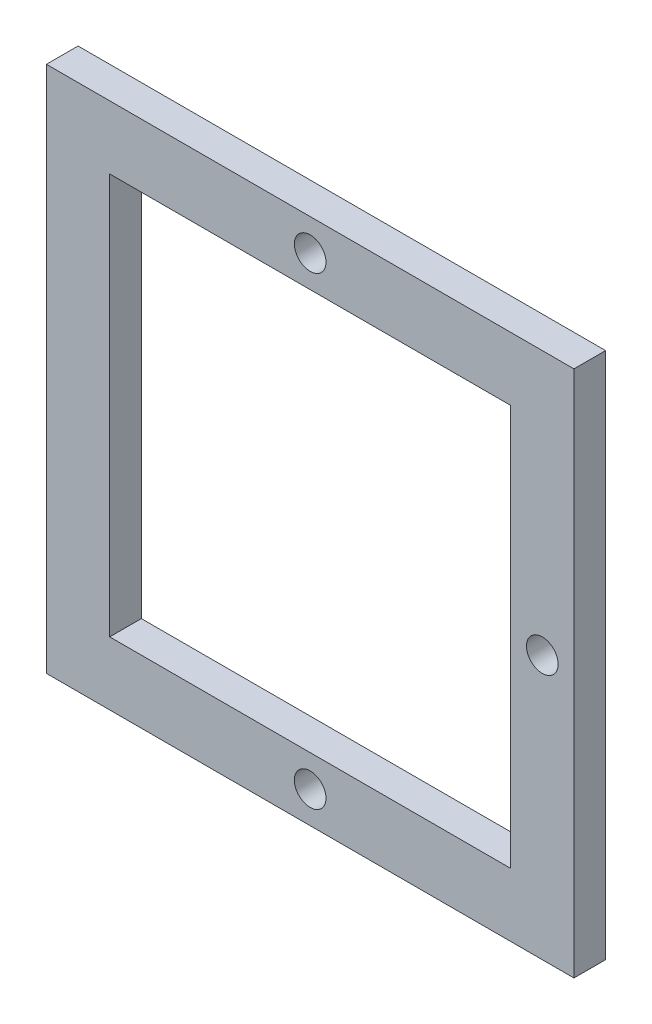
ISO-10303-21;
HEADER;
FILE_DESCRIPTION(('STEP AP214'),'2;1');
FILE_NAME('part.step','',(''),(''),'','','');
FILE_SCHEMA(('AUTOMOTIVE_DESIGN { 1 0 10303 214 1 1 1 1 }'));
ENDSEC;
DATA;
#1=APPLICATION_CONTEXT('core data for automotive mechanical design processes');
#2=APPLICATION_PROTOCOL_DEFINITION('international standard','automotive_design',2000,#1);
#3=PRODUCT_CONTEXT('',#1,'mechanical');
#4=PRODUCT('Part','Part','',(#3));
#5=PRODUCT_RELATED_PRODUCT_CATEGORY('part','',(#4));
#6=PRODUCT_DEFINITION_FORMATION('','',#4);
#7=PRODUCT_DEFINITION_CONTEXT('part definition',#1,'design');
#8=PRODUCT_DEFINITION('design','',#6,#7);
#9=PRODUCT_DEFINITION_SHAPE('','',#8);
#10=(LENGTH_UNIT() NAMED_UNIT(*) SI_UNIT(.MILLI.,.METRE.));
#11=(NAMED_UNIT(*) PLANE_ANGLE_UNIT() SI_UNIT($,.RADIAN.));
#12=(NAMED_UNIT(*) SI_UNIT($,.STERADIAN.) SOLID_ANGLE_UNIT());
#13=UNCERTAINTY_MEASURE_WITH_UNIT(LENGTH_MEASURE(1.E-05),#10,'distance_accuracy_value','');
#14=(GEOMETRIC_REPRESENTATION_CONTEXT(3) GLOBAL_UNCERTAINTY_ASSIGNED_CONTEXT((#13)) GLOBAL_UNIT_ASSIGNED_CONTEXT((#10,
#11,#12)) REPRESENTATION_CONTEXT('',''));
#15=CARTESIAN_POINT('',(0.,0.,0.));
#16=DIRECTION('',(0.,0.,1.));
#17=DIRECTION('',(1.,0.,0.));
#18=AXIS2_PLACEMENT_3D('',#15,#16,#17);
#19=CARTESIAN_POINT('',(-25.,25.,-79.6));
#20=DIRECTION('',(-1.,0.,0.));
#21=DIRECTION('',(0.,1.,0.));
#22=AXIS2_PLACEMENT_3D('',#19,#20,#21);
#23=PLANE('',#22);
#24=DIRECTION('',(0.,-1.,0.));
#25=VECTOR('',#24,1.);
#26=CARTESIAN_POINT('',(-25.,-25.,-76.6));
#27=LINE('',#26,#25);
#28=CARTESIAN_POINT('',(-25.,25.,-76.6));
#29=VERTEX_POINT('',#28);
#30=CARTESIAN_POINT('',(-25.,-25.,-76.6));
#31=VERTEX_POINT('',#30);
#32=EDGE_CURVE('E144',#29,#31,#27,.T.);
#33=ORIENTED_EDGE('',*,*,#32,.T.);
#34=DIRECTION('',(0.,0.,-1.));
#35=VECTOR('',#34,1.);
#36=CARTESIAN_POINT('',(-25.,-25.,-73.6));
#37=LINE('',#36,#35);
#38=CARTESIAN_POINT('',(-25.,-25.,-73.6));
#39=VERTEX_POINT('',#38);
#40=EDGE_CURVE('E185',#39,#31,#37,.T.);
#41=ORIENTED_EDGE('',*,*,#40,.F.);
#42=DIRECTION('',(0.,-1.,0.));
#43=VECTOR('',#42,1.);
#44=CARTESIAN_POINT('',(-25.,-25.,-73.6));
#45=LINE('',#44,#43);
#46=CARTESIAN_POINT('',(-25.,25.,-73.6));
#47=VERTEX_POINT('',#46);
#48=EDGE_CURVE('E149',#47,#39,#45,.T.);
#49=ORIENTED_EDGE('',*,*,#48,.F.);
#50=DIRECTION('',(0.,0.,-1.));
#51=VECTOR('',#50,1.);
#52=CARTESIAN_POINT('',(-25.,25.,-73.6));
#53=LINE('',#52,#51);
#54=EDGE_CURVE('E163',#47,#29,#53,.T.);
#55=ORIENTED_EDGE('',*,*,#54,.T.);
#56=EDGE_LOOP('',(#33,#41,#49,#55));
#57=FACE_BOUND('',#56,.T.);
#58=ADVANCED_FACE('F47',(#57),#23,.T.);
#59=CARTESIAN_POINT('',(-25.,-25.,-79.6));
#60=DIRECTION('',(0.,-1.,0.));
#61=DIRECTION('',(0.,0.,1.));
#62=AXIS2_PLACEMENT_3D('',#59,#60,#61);
#63=PLANE('',#62);
#64=DIRECTION('',(1.,0.,0.));
#65=VECTOR('',#64,1.);
#66=CARTESIAN_POINT('',(25.,-25.,-76.6));
#67=LINE('',#66,#65);
#68=CARTESIAN_POINT('',(25.,-25.,-76.6));
#69=VERTEX_POINT('',#68);
#70=EDGE_CURVE('E166',#31,#69,#67,.T.);
#71=ORIENTED_EDGE('',*,*,#70,.T.);
#72=DIRECTION('',(0.,0.,-1.));
#73=VECTOR('',#72,1.);
#74=CARTESIAN_POINT('',(25.,-25.,-73.6));
#75=LINE('',#74,#73);
#76=CARTESIAN_POINT('',(25.,-25.,-73.6));
#77=VERTEX_POINT('',#76);
#78=EDGE_CURVE('E181',#77,#69,#75,.T.);
#79=ORIENTED_EDGE('',*,*,#78,.F.);
#80=DIRECTION('',(1.,0.,0.));
#81=VECTOR('',#80,1.);
#82=CARTESIAN_POINT('',(25.,-25.,-73.6));
#83=LINE('',#82,#81);
#84=EDGE_CURVE('E153',#39,#77,#83,.T.);
#85=ORIENTED_EDGE('',*,*,#84,.F.);
#86=ORIENTED_EDGE('',*,*,#40,.T.);
#87=EDGE_LOOP('',(#71,#79,#85,#86));
#88=FACE_BOUND('',#87,.T.);
#89=ADVANCED_FACE('F238',(#88),#63,.T.);
#90=CARTESIAN_POINT('',(25.,-25.,-79.6));
#91=DIRECTION('',(1.,0.,0.));
#92=DIRECTION('',(0.,0.,-1.));
#93=AXIS2_PLACEMENT_3D('',#90,#91,#92);
#94=PLANE('',#93);
#95=DIRECTION('',(0.,1.,0.));
#96=VECTOR('',#95,1.);
#97=CARTESIAN_POINT('',(25.,-25.,-76.6));
#98=LINE('',#97,#96);
#99=CARTESIAN_POINT('',(25.,25.,-76.6));
#100=VERTEX_POINT('',#99);
#101=EDGE_CURVE('E169',#69,#100,#98,.T.);
#102=ORIENTED_EDGE('',*,*,#101,.T.);
#103=DIRECTION('',(0.,0.,-1.));
#104=VECTOR('',#103,1.);
#105=CARTESIAN_POINT('',(25.,25.,-73.6));
#106=LINE('',#105,#104);
#107=CARTESIAN_POINT('',(25.,25.,-73.6));
#108=VERTEX_POINT('',#107);
#109=EDGE_CURVE('E177',#108,#100,#106,.T.);
#110=ORIENTED_EDGE('',*,*,#109,.F.);
#111=DIRECTION('',(0.,1.,0.));
#112=VECTOR('',#111,1.);
#113=CARTESIAN_POINT('',(25.,-25.,-73.6));
#114=LINE('',#113,#112);
#115=EDGE_CURVE('E157',#77,#108,#114,.T.);
#116=ORIENTED_EDGE('',*,*,#115,.F.);
#117=ORIENTED_EDGE('',*,*,#78,.T.);
#118=EDGE_LOOP('',(#102,#110,#116,#117));
#119=FACE_BOUND('',#118,.T.);
#120=ADVANCED_FACE('F244',(#119),#94,.T.);
#121=CARTESIAN_POINT('',(25.,25.,-79.6));
#122=DIRECTION('',(0.,1.,0.));
#123=DIRECTION('',(0.,0.,1.));
#124=AXIS2_PLACEMENT_3D('',#121,#122,#123);
#125=PLANE('',#124);
#126=DIRECTION('',(-1.,0.,0.));
#127=VECTOR('',#126,1.);
#128=CARTESIAN_POINT('',(25.,25.,-76.6));
#129=LINE('',#128,#127);
#130=EDGE_CURVE('E154',#100,#29,#129,.T.);
#131=ORIENTED_EDGE('',*,*,#130,.T.);
#132=ORIENTED_EDGE('',*,*,#54,.F.);
#133=DIRECTION('',(-1.,0.,0.));
#134=VECTOR('',#133,1.);
#135=CARTESIAN_POINT('',(25.,25.,-73.6));
#136=LINE('',#135,#134);
#137=EDGE_CURVE('E160',#108,#47,#136,.T.);
#138=ORIENTED_EDGE('',*,*,#137,.F.);
#139=ORIENTED_EDGE('',*,*,#109,.T.);
#140=EDGE_LOOP('',(#131,#132,#138,#139));
#141=FACE_BOUND('',#140,.T.);
#142=ADVANCED_FACE('F248',(#141),#125,.T.);
#143=CARTESIAN_POINT('',(0.,-22.,-76.6));
#144=DIRECTION('',(0.,0.,-1.));
#145=DIRECTION('',(0.,-1.,0.));
#146=AXIS2_PLACEMENT_3D('',#143,#144,#145);
#147=CYLINDRICAL_SURFACE('',#146,1.5);
#148=CARTESIAN_POINT('',(0.,-22.,-73.6));
#149=DIRECTION('',(0.,0.,1.));
#150=DIRECTION('',(1.,0.,0.));
#151=AXIS2_PLACEMENT_3D('',#148,#149,#150);
#152=CIRCLE('',#151,1.5);
#153=CARTESIAN_POINT('',(1.5,-22.,-73.6));
#154=VERTEX_POINT('',#153);
#155=EDGE_CURVE('E197',#154,#154,#152,.T.);
#156=ORIENTED_EDGE('',*,*,#155,.T.);
#157=EDGE_LOOP('',(#156));
#158=FACE_BOUND('',#157,.T.);
#159=CARTESIAN_POINT('',(0.,-22.,-76.6));
#160=DIRECTION('',(0.,0.,-1.));
#161=DIRECTION('',(-1.,0.,0.));
#162=AXIS2_PLACEMENT_3D('',#159,#160,#161);
#163=CIRCLE('',#162,1.5);
#164=CARTESIAN_POINT('',(-1.5,-22.,-76.6));
#165=VERTEX_POINT('',#164);
#166=EDGE_CURVE('E201',#165,#165,#163,.F.);
#167=ORIENTED_EDGE('',*,*,#166,.F.);
#168=EDGE_LOOP('',(#167));
#169=FACE_BOUND('',#168,.T.);
#170=ADVANCED_FACE('F236',(#158,#169),#147,.F.);
#171=CARTESIAN_POINT('',(22.0000003278255,0.,-76.6));
#172=DIRECTION('',(0.,0.,-1.));
#173=DIRECTION('',(0.,-1.,0.));
#174=AXIS2_PLACEMENT_3D('',#171,#172,#173);
#175=CYLINDRICAL_SURFACE('',#174,1.5);
#176=CARTESIAN_POINT('',(22.0000003278255,0.,-73.6));
#177=DIRECTION('',(0.,0.,1.));
#178=DIRECTION('',(1.,0.,0.));
#179=AXIS2_PLACEMENT_3D('',#176,#177,#178);
#180=CIRCLE('',#179,1.5);
#181=CARTESIAN_POINT('',(23.5000003278255,0.,-73.6));
#182=VERTEX_POINT('',#181);
#183=EDGE_CURVE('E200',#182,#182,#180,.T.);
#184=ORIENTED_EDGE('',*,*,#183,.T.);
#185=EDGE_LOOP('',(#184));
#186=FACE_BOUND('',#185,.T.);
#187=CARTESIAN_POINT('',(22.0000003278255,0.,-76.6));
#188=DIRECTION('',(0.,0.,-1.));
#189=DIRECTION('',(-1.,0.,0.));
#190=AXIS2_PLACEMENT_3D('',#187,#188,#189);
#191=CIRCLE('',#190,1.5);
#192=CARTESIAN_POINT('',(20.5000003278255,0.,-76.6));
#193=VERTEX_POINT('',#192);
#194=EDGE_CURVE('E215',#193,#193,#191,.F.);
#195=ORIENTED_EDGE('',*,*,#194,.F.);
#196=EDGE_LOOP('',(#195));
#197=FACE_BOUND('',#196,.T.);
#198=ADVANCED_FACE('F228',(#186,#197),#175,.F.);
#199=CARTESIAN_POINT('',(0.,22.,-76.6));
#200=DIRECTION('',(0.,0.,-1.));
#201=DIRECTION('',(0.,-1.,0.));
#202=AXIS2_PLACEMENT_3D('',#199,#200,#201);
#203=CYLINDRICAL_SURFACE('',#202,1.5);
#204=CARTESIAN_POINT('',(0.,22.,-73.6));
#205=DIRECTION('',(0.,0.,1.));
#206=DIRECTION('',(1.,0.,0.));
#207=AXIS2_PLACEMENT_3D('',#204,#205,#206);
#208=CIRCLE('',#207,1.5);
#209=CARTESIAN_POINT('',(1.5,22.,-73.6));
#210=VERTEX_POINT('',#209);
#211=EDGE_CURVE('E51',#210,#210,#208,.T.);
#212=ORIENTED_EDGE('',*,*,#211,.T.);
#213=EDGE_LOOP('',(#212));
#214=FACE_BOUND('',#213,.T.);
#215=CARTESIAN_POINT('',(0.,22.,-76.6));
#216=DIRECTION('',(0.,0.,-1.));
#217=DIRECTION('',(-1.,0.,0.));
#218=AXIS2_PLACEMENT_3D('',#215,#216,#217);
#219=CIRCLE('',#218,1.5);
#220=CARTESIAN_POINT('',(-1.5,22.,-76.6));
#221=VERTEX_POINT('',#220);
#222=EDGE_CURVE('E219',#221,#221,#219,.F.);
#223=ORIENTED_EDGE('',*,*,#222,.F.);
#224=EDGE_LOOP('',(#223));
#225=FACE_BOUND('',#224,.T.);
#226=ADVANCED_FACE('F49',(#214,#225),#203,.F.);
#227=CARTESIAN_POINT('',(19.,19.,-88.6));
#228=DIRECTION('',(0.,1.,0.));
#229=DIRECTION('',(-1.,0.,0.));
#230=AXIS2_PLACEMENT_3D('',#227,#228,#229);
#231=PLANE('',#230);
#232=DIRECTION('',(0.,0.,1.));
#233=VECTOR('',#232,1.);
#234=CARTESIAN_POINT('',(-19.,19.,-88.6));
#235=LINE('',#234,#233);
#236=CARTESIAN_POINT('',(-19.,19.,-76.6));
#237=VERTEX_POINT('',#236);
#238=CARTESIAN_POINT('',(-19.,19.,-73.6));
#239=VERTEX_POINT('',#238);
#240=EDGE_CURVE('E141',#237,#239,#235,.T.);
#241=ORIENTED_EDGE('',*,*,#240,.F.);
#242=DIRECTION('',(-1.,0.,0.));
#243=VECTOR('',#242,1.);
#244=CARTESIAN_POINT('',(0.,19.,-76.6));
#245=LINE('',#244,#243);
#246=CARTESIAN_POINT('',(19.,19.,-76.6));
#247=VERTEX_POINT('',#246);
#248=EDGE_CURVE('E11',#247,#237,#245,.T.);
#249=ORIENTED_EDGE('',*,*,#248,.F.);
#250=DIRECTION('',(0.,0.,1.));
#251=VECTOR('',#250,1.);
#252=CARTESIAN_POINT('',(19.,19.,-88.6));
#253=LINE('',#252,#251);
#254=CARTESIAN_POINT('',(19.,19.,-73.6));
#255=VERTEX_POINT('',#254);
#256=EDGE_CURVE('E122',#247,#255,#253,.T.);
#257=ORIENTED_EDGE('',*,*,#256,.T.);
#258=DIRECTION('',(-1.,0.,0.));
#259=VECTOR('',#258,1.);
#260=CARTESIAN_POINT('',(19.,19.,-73.6));
#261=LINE('',#260,#259);
#262=EDGE_CURVE('E134',#255,#239,#261,.T.);
#263=ORIENTED_EDGE('',*,*,#262,.T.);
#264=EDGE_LOOP('',(#241,#249,#257,#263));
#265=FACE_BOUND('',#264,.T.);
#266=ADVANCED_FACE('F227',(#265),#231,.F.);
#267=CARTESIAN_POINT('',(-19.,-19.,-88.6));
#268=DIRECTION('',(-1.,0.,0.));
#269=DIRECTION('',(0.,0.,1.));
#270=AXIS2_PLACEMENT_3D('',#267,#268,#269);
#271=PLANE('',#270);
#272=DIRECTION('',(0.,-1.,0.));
#273=VECTOR('',#272,1.);
#274=CARTESIAN_POINT('',(-19.,0.,-76.6));
#275=LINE('',#274,#273);
#276=CARTESIAN_POINT('',(-19.,-19.,-76.6));
#277=VERTEX_POINT('',#276);
#278=EDGE_CURVE('E57',#237,#277,#275,.T.);
#279=ORIENTED_EDGE('',*,*,#278,.F.);
#280=ORIENTED_EDGE('',*,*,#240,.T.);
#281=DIRECTION('',(0.,-1.,0.));
#282=VECTOR('',#281,1.);
#283=CARTESIAN_POINT('',(-19.,-19.,-73.6));
#284=LINE('',#283,#282);
#285=CARTESIAN_POINT('',(-19.,-19.,-73.6));
#286=VERTEX_POINT('',#285);
#287=EDGE_CURVE('E65',#239,#286,#284,.T.);
#288=ORIENTED_EDGE('',*,*,#287,.T.);
#289=DIRECTION('',(0.,0.,1.));
#290=VECTOR('',#289,1.);
#291=CARTESIAN_POINT('',(-19.,-19.,-88.6));
#292=LINE('',#291,#290);
#293=EDGE_CURVE('E123',#277,#286,#292,.T.);
#294=ORIENTED_EDGE('',*,*,#293,.F.);
#295=EDGE_LOOP('',(#279,#280,#288,#294));
#296=FACE_BOUND('',#295,.T.);
#297=ADVANCED_FACE('F233',(#296),#271,.F.);
#298=CARTESIAN_POINT('',(19.,-19.,-88.6));
#299=DIRECTION('',(1.,0.,0.));
#300=DIRECTION('',(0.,0.,-1.));
#301=AXIS2_PLACEMENT_3D('',#298,#299,#300);
#302=PLANE('',#301);
#303=ORIENTED_EDGE('',*,*,#256,.F.);
#304=DIRECTION('',(0.,1.,0.));
#305=VECTOR('',#304,1.);
#306=CARTESIAN_POINT('',(19.,0.,-76.6));
#307=LINE('',#306,#305);
#308=CARTESIAN_POINT('',(19.,-19.,-76.6));
#309=VERTEX_POINT('',#308);
#310=EDGE_CURVE('E119',#309,#247,#307,.T.);
#311=ORIENTED_EDGE('',*,*,#310,.F.);
#312=DIRECTION('',(0.,0.,1.));
#313=VECTOR('',#312,1.);
#314=CARTESIAN_POINT('',(19.,-19.,-88.6));
#315=LINE('',#314,#313);
#316=CARTESIAN_POINT('',(19.,-19.,-73.6));
#317=VERTEX_POINT('',#316);
#318=EDGE_CURVE('E73',#309,#317,#315,.T.);
#319=ORIENTED_EDGE('',*,*,#318,.T.);
#320=DIRECTION('',(0.,1.,0.));
#321=VECTOR('',#320,1.);
#322=CARTESIAN_POINT('',(19.,-19.,-73.6));
#323=LINE('',#322,#321);
#324=EDGE_CURVE('E117',#317,#255,#323,.T.);
#325=ORIENTED_EDGE('',*,*,#324,.T.);
#326=EDGE_LOOP('',(#303,#311,#319,#325));
#327=FACE_BOUND('',#326,.T.);
#328=ADVANCED_FACE('F115',(#327),#302,.F.);
#329=CARTESIAN_POINT('',(19.,-19.,-88.6));
#330=DIRECTION('',(0.,-1.,0.));
#331=DIRECTION('',(1.,0.,0.));
#332=AXIS2_PLACEMENT_3D('',#329,#330,#331);
#333=PLANE('',#332);
#334=DIRECTION('',(1.,0.,0.));
#335=VECTOR('',#334,1.);
#336=CARTESIAN_POINT('',(0.,-19.,-76.6));
#337=LINE('',#336,#335);
#338=EDGE_CURVE('E189',#277,#309,#337,.T.);
#339=ORIENTED_EDGE('',*,*,#338,.F.);
#340=ORIENTED_EDGE('',*,*,#293,.T.);
#341=DIRECTION('',(1.,0.,0.));
#342=VECTOR('',#341,1.);
#343=CARTESIAN_POINT('',(19.,-19.,-73.6));
#344=LINE('',#343,#342);
#345=EDGE_CURVE('E126',#286,#317,#344,.T.);
#346=ORIENTED_EDGE('',*,*,#345,.T.);
#347=ORIENTED_EDGE('',*,*,#318,.F.);
#348=EDGE_LOOP('',(#339,#340,#346,#347));
#349=FACE_BOUND('',#348,.T.);
#350=ADVANCED_FACE('F127',(#349),#333,.F.);
#351=CARTESIAN_POINT('',(0.,0.,-73.6));
#352=DIRECTION('',(0.,0.,1.));
#353=DIRECTION('',(1.,0.,0.));
#354=AXIS2_PLACEMENT_3D('',#351,#352,#353);
#355=PLANE('',#354);
#356=ORIENTED_EDGE('',*,*,#211,.F.);
#357=EDGE_LOOP('',(#356));
#358=FACE_BOUND('',#357,.T.);
#359=ORIENTED_EDGE('',*,*,#183,.F.);
#360=EDGE_LOOP('',(#359));
#361=FACE_BOUND('',#360,.T.);
#362=ORIENTED_EDGE('',*,*,#155,.F.);
#363=EDGE_LOOP('',(#362));
#364=FACE_BOUND('',#363,.T.);
#365=ORIENTED_EDGE('',*,*,#287,.F.);
#366=ORIENTED_EDGE('',*,*,#262,.F.);
#367=ORIENTED_EDGE('',*,*,#324,.F.);
#368=ORIENTED_EDGE('',*,*,#345,.F.);
#369=EDGE_LOOP('',(#365,#366,#367,#368));
#370=FACE_BOUND('',#369,.T.);
#371=ORIENTED_EDGE('',*,*,#48,.T.);
#372=ORIENTED_EDGE('',*,*,#84,.T.);
#373=ORIENTED_EDGE('',*,*,#115,.T.);
#374=ORIENTED_EDGE('',*,*,#137,.T.);
#375=EDGE_LOOP('',(#371,#372,#373,#374));
#376=FACE_BOUND('',#375,.T.);
#377=ADVANCED_FACE('F131',(#358,#361,#364,#370,#376),#355,.T.);
#378=CARTESIAN_POINT('',(0.,0.,-76.6));
#379=DIRECTION('',(0.,0.,1.));
#380=DIRECTION('',(1.,0.,0.));
#381=AXIS2_PLACEMENT_3D('',#378,#379,#380);
#382=PLANE('',#381);
#383=ORIENTED_EDGE('',*,*,#130,.F.);
#384=ORIENTED_EDGE('',*,*,#101,.F.);
#385=ORIENTED_EDGE('',*,*,#70,.F.);
#386=ORIENTED_EDGE('',*,*,#32,.F.);
#387=EDGE_LOOP('',(#383,#384,#385,#386));
#388=FACE_BOUND('',#387,.T.);
#389=ORIENTED_EDGE('',*,*,#338,.T.);
#390=ORIENTED_EDGE('',*,*,#310,.T.);
#391=ORIENTED_EDGE('',*,*,#248,.T.);
#392=ORIENTED_EDGE('',*,*,#278,.T.);
#393=EDGE_LOOP('',(#389,#390,#391,#392));
#394=FACE_BOUND('',#393,.T.);
#395=ORIENTED_EDGE('',*,*,#166,.T.);
#396=EDGE_LOOP('',(#395));
#397=FACE_BOUND('',#396,.T.);
#398=ORIENTED_EDGE('',*,*,#194,.T.);
#399=EDGE_LOOP('',(#398));
#400=FACE_BOUND('',#399,.T.);
#401=ORIENTED_EDGE('',*,*,#222,.T.);
#402=EDGE_LOOP('',(#401));
#403=FACE_BOUND('',#402,.T.);
#404=ADVANCED_FACE('F224',(#388,#394,#397,#400,#403),#382,.F.);
#405=CLOSED_SHELL('',(#58,#89,#120,#142,#170,#198,#226,#266,#297,#328,#350,#377,#404));
#406=MANIFOLD_SOLID_BREP('B2',#405);
#407=ADVANCED_BREP_SHAPE_REPRESENTATION('',(#18,#406),#14);
#408=SHAPE_DEFINITION_REPRESENTATION(#9,#407);
ENDSEC;
END-ISO-10303-21;
